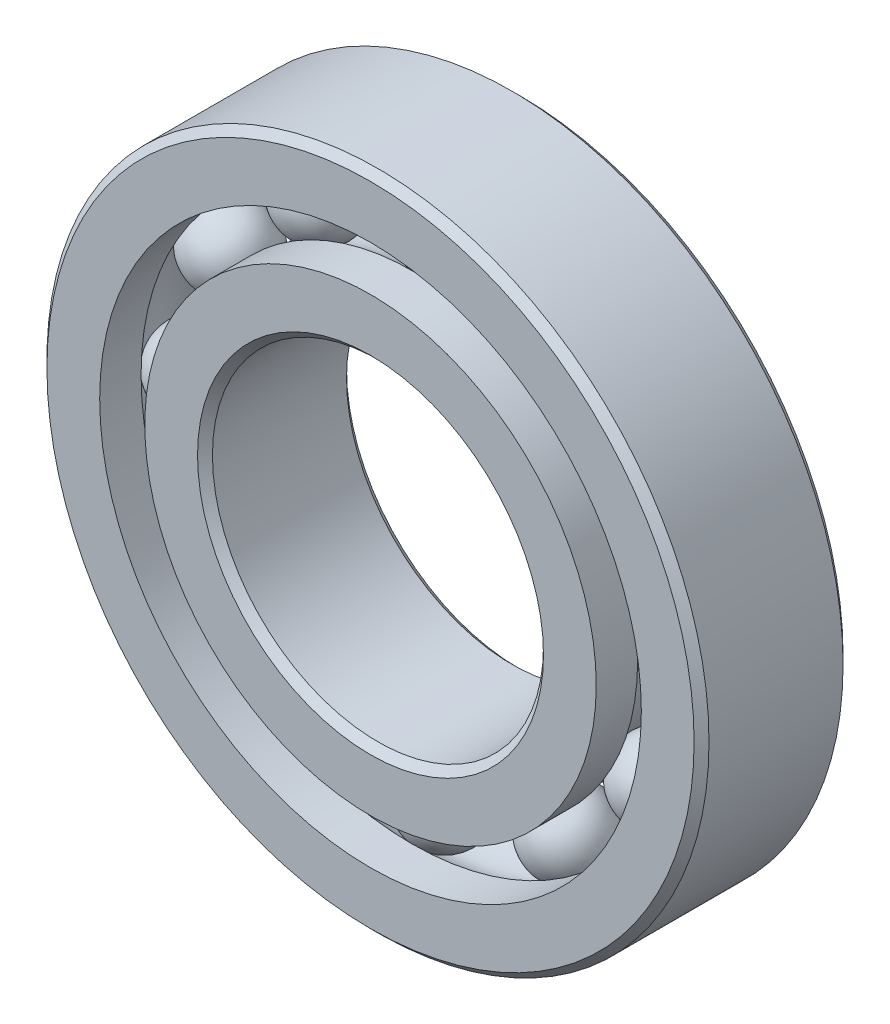
ISO-10303-21;
HEADER;
FILE_DESCRIPTION(('STEP AP214'),'2;1');
FILE_NAME('part.step','',(''),(''),'','','');
FILE_SCHEMA(('AUTOMOTIVE_DESIGN { 1 0 10303 214 1 1 1 1 }'));
ENDSEC;
DATA;
#1=APPLICATION_CONTEXT('core data for automotive mechanical design processes');
#2=APPLICATION_PROTOCOL_DEFINITION('international standard','automotive_design',2000,#1);
#3=PRODUCT_CONTEXT('',#1,'mechanical');
#4=PRODUCT('Part','Part','',(#3));
#5=PRODUCT_RELATED_PRODUCT_CATEGORY('part','',(#4));
#6=PRODUCT_DEFINITION_FORMATION('','',#4);
#7=PRODUCT_DEFINITION_CONTEXT('part definition',#1,'design');
#8=PRODUCT_DEFINITION('design','',#6,#7);
#9=PRODUCT_DEFINITION_SHAPE('','',#8);
#10=(LENGTH_UNIT() NAMED_UNIT(*) SI_UNIT(.MILLI.,.METRE.));
#11=(NAMED_UNIT(*) PLANE_ANGLE_UNIT() SI_UNIT($,.RADIAN.));
#12=(NAMED_UNIT(*) SI_UNIT($,.STERADIAN.) SOLID_ANGLE_UNIT());
#13=UNCERTAINTY_MEASURE_WITH_UNIT(LENGTH_MEASURE(1.E-05),#10,'distance_accuracy_value','');
#14=(GEOMETRIC_REPRESENTATION_CONTEXT(3) GLOBAL_UNCERTAINTY_ASSIGNED_CONTEXT((#13)) GLOBAL_UNIT_ASSIGNED_CONTEXT((#10,
#11,#12)) REPRESENTATION_CONTEXT('',''));
#15=CARTESIAN_POINT('',(0.,0.,0.));
#16=DIRECTION('',(0.,0.,1.));
#17=DIRECTION('',(1.,0.,0.));
#18=AXIS2_PLACEMENT_3D('',#15,#16,#17);
#19=CARTESIAN_POINT('',(-14.9999999999997,25.9807621135334,0.));
#20=DIRECTION('',(0.,0.,1.));
#21=DIRECTION('',(-0.499999999999989,0.866025403784445,0.));
#22=AXIS2_PLACEMENT_3D('',#19,#20,#21);
#23=SPHERICAL_SURFACE('',#22,4.84015726275719);
#24=CARTESIAN_POINT('',(-14.9999999999997,25.9807621135334,4.8401572627572));
#25=VERTEX_POINT('',#24);
#26=VERTEX_LOOP('',#25);
#27=FACE_BOUND('',#26,.T.);
#28=ADVANCED_FACE('F39',(#27),#23,.T.);
#29=CLOSED_SHELL('',(#28));
#30=MANIFOLD_SOLID_BREP('B2',#29);
#31=CARTESIAN_POINT('',(-25.980762113533,15.0000000000003,0.));
#32=DIRECTION('',(0.,0.,1.));
#33=DIRECTION('',(-0.866025403784433,0.50000000000001,0.));
#34=AXIS2_PLACEMENT_3D('',#31,#32,#33);
#35=SPHERICAL_SURFACE('',#34,4.84015726275719);
#36=CARTESIAN_POINT('',(-25.980762113533,15.0000000000003,4.8401572627572));
#37=VERTEX_POINT('',#36);
#38=VERTEX_LOOP('',#37);
#39=FACE_BOUND('',#38,.T.);
#40=ADVANCED_FACE('F59',(#39),#35,.T.);
#41=CLOSED_SHELL('',(#40));
#42=MANIFOLD_SOLID_BREP('B6',#41);
#43=CARTESIAN_POINT('',(-30.,3.14233320495882E-13,0.));
#44=DIRECTION('',(0.,0.,1.));
#45=DIRECTION('',(-1.,0.,0.));
#46=AXIS2_PLACEMENT_3D('',#43,#44,#45);
#47=SPHERICAL_SURFACE('',#46,4.84015726275719);
#48=CARTESIAN_POINT('',(-30.,3.14233320495882E-13,4.8401572627572));
#49=VERTEX_POINT('',#48);
#50=VERTEX_LOOP('',#49);
#51=FACE_BOUND('',#50,.T.);
#52=ADVANCED_FACE('F79',(#51),#47,.T.);
#53=CLOSED_SHELL('',(#52));
#54=MANIFOLD_SOLID_BREP('B35',#53);
#55=CARTESIAN_POINT('',(-25.9807621135333,-14.9999999999998,0.));
#56=DIRECTION('',(0.,0.,1.));
#57=DIRECTION('',(-0.866025403784443,-0.499999999999992,0.));
#58=AXIS2_PLACEMENT_3D('',#55,#56,#57);
#59=SPHERICAL_SURFACE('',#58,4.84015726275719);
#60=CARTESIAN_POINT('',(-25.9807621135333,-14.9999999999998,4.8401572627572));
#61=VERTEX_POINT('',#60);
#62=VERTEX_LOOP('',#61);
#63=FACE_BOUND('',#62,.T.);
#64=ADVANCED_FACE('F99',(#63),#59,.T.);
#65=CLOSED_SHELL('',(#64));
#66=MANIFOLD_SOLID_BREP('B55',#65);
#67=CARTESIAN_POINT('',(-15.0000000000002,-25.980762113533,0.));
#68=DIRECTION('',(0.,0.,1.));
#69=DIRECTION('',(-0.500000000000007,-0.866025403784435,0.));
#70=AXIS2_PLACEMENT_3D('',#67,#68,#69);
#71=SPHERICAL_SURFACE('',#70,4.84015726275719);
#72=CARTESIAN_POINT('',(-15.0000000000002,-25.980762113533,4.8401572627572));
#73=VERTEX_POINT('',#72);
#74=VERTEX_LOOP('',#73);
#75=FACE_BOUND('',#74,.T.);
#76=ADVANCED_FACE('F119',(#75),#71,.T.);
#77=CLOSED_SHELL('',(#76));
#78=MANIFOLD_SOLID_BREP('B75',#77);
#79=CARTESIAN_POINT('',(-2.09488880330588E-13,-30.,0.));
#80=DIRECTION('',(0.,0.,1.));
#81=DIRECTION('',(0.,-1.,0.));
#82=AXIS2_PLACEMENT_3D('',#79,#80,#81);
#83=SPHERICAL_SURFACE('',#82,4.84015726275719);
#84=CARTESIAN_POINT('',(-2.09488880330588E-13,-30.,4.8401572627572));
#85=VERTEX_POINT('',#84);
#86=VERTEX_LOOP('',#85);
#87=FACE_BOUND('',#86,.T.);
#88=ADVANCED_FACE('F139',(#87),#83,.T.);
#89=CLOSED_SHELL('',(#88));
#90=MANIFOLD_SOLID_BREP('B95',#89);
#91=CARTESIAN_POINT('',(14.9999999999998,-25.9807621135332,0.));
#92=DIRECTION('',(0.,0.,1.));
#93=DIRECTION('',(0.499999999999995,-0.866025403784442,0.));
#94=AXIS2_PLACEMENT_3D('',#91,#92,#93);
#95=SPHERICAL_SURFACE('',#94,4.84015726275719);
#96=CARTESIAN_POINT('',(14.9999999999998,-25.9807621135332,4.8401572627572));
#97=VERTEX_POINT('',#96);
#98=VERTEX_LOOP('',#97);
#99=FACE_BOUND('',#98,.T.);
#100=ADVANCED_FACE('F159',(#99),#95,.T.);
#101=CLOSED_SHELL('',(#100));
#102=MANIFOLD_SOLID_BREP('B115',#101);
#103=CARTESIAN_POINT('',(25.9807621135331,-15.0000000000001,0.));
#104=DIRECTION('',(0.,0.,1.));
#105=DIRECTION('',(0.866025403784436,-0.500000000000004,0.));
#106=AXIS2_PLACEMENT_3D('',#103,#104,#105);
#107=SPHERICAL_SURFACE('',#106,4.84015726275719);
#108=CARTESIAN_POINT('',(25.9807621135331,-15.0000000000001,4.8401572627572));
#109=VERTEX_POINT('',#108);
#110=VERTEX_LOOP('',#109);
#111=FACE_BOUND('',#110,.T.);
#112=ADVANCED_FACE('F179',(#111),#107,.T.);
#113=CLOSED_SHELL('',(#112));
#114=MANIFOLD_SOLID_BREP('B135',#113);
#115=CARTESIAN_POINT('',(30.,-1.04744440165294E-13,0.));
#116=DIRECTION('',(0.,0.,1.));
#117=DIRECTION('',(1.,0.,0.));
#118=AXIS2_PLACEMENT_3D('',#115,#116,#117);
#119=SPHERICAL_SURFACE('',#118,4.84015726275719);
#120=CARTESIAN_POINT('',(30.,-1.04744440165294E-13,4.8401572627572));
#121=VERTEX_POINT('',#120);
#122=VERTEX_LOOP('',#121);
#123=FACE_BOUND('',#122,.T.);
#124=ADVANCED_FACE('F199',(#123),#119,.T.);
#125=CLOSED_SHELL('',(#124));
#126=MANIFOLD_SOLID_BREP('B155',#125);
#127=CARTESIAN_POINT('',(25.9807621135332,14.9999999999999,0.));
#128=DIRECTION('',(0.,0.,1.));
#129=DIRECTION('',(0.86602540378444,0.499999999999998,0.));
#130=AXIS2_PLACEMENT_3D('',#127,#128,#129);
#131=SPHERICAL_SURFACE('',#130,4.84015726275719);
#132=CARTESIAN_POINT('',(25.9807621135332,14.9999999999999,4.8401572627572));
#133=VERTEX_POINT('',#132);
#134=VERTEX_LOOP('',#133);
#135=FACE_BOUND('',#134,.T.);
#136=ADVANCED_FACE('F219',(#135),#131,.T.);
#137=CLOSED_SHELL('',(#136));
#138=MANIFOLD_SOLID_BREP('B175',#137);
#139=CARTESIAN_POINT('',(15.,25.9807621135331,0.));
#140=DIRECTION('',(0.,0.,1.));
#141=DIRECTION('',(0.500000000000001,0.866025403784438,0.));
#142=AXIS2_PLACEMENT_3D('',#139,#140,#141);
#143=SPHERICAL_SURFACE('',#142,4.84015726275719);
#144=CARTESIAN_POINT('',(15.,25.9807621135331,4.8401572627572));
#145=VERTEX_POINT('',#144);
#146=VERTEX_LOOP('',#145);
#147=FACE_BOUND('',#146,.T.);
#148=ADVANCED_FACE('F239',(#147),#143,.T.);
#149=CLOSED_SHELL('',(#148));
#150=MANIFOLD_SOLID_BREP('B195',#149);
#151=CARTESIAN_POINT('',(0.,30.,0.));
#152=DIRECTION('',(0.,0.,1.));
#153=DIRECTION('',(0.,1.,0.));
#154=AXIS2_PLACEMENT_3D('',#151,#152,#153);
#155=SPHERICAL_SURFACE('',#154,4.84015726275719);
#156=CARTESIAN_POINT('',(0.,30.,4.8401572627572));
#157=VERTEX_POINT('',#156);
#158=VERTEX_LOOP('',#157);
#159=FACE_BOUND('',#158,.T.);
#160=ADVANCED_FACE('F261',(#159),#155,.T.);
#161=CLOSED_SHELL('',(#160));
#162=MANIFOLD_SOLID_BREP('B215',#161);
#163=CARTESIAN_POINT('',(0.,27.2747252747253,9.00000000000001));
#164=DIRECTION('',(0.,0.,-1.));
#165=DIRECTION('',(-1.,0.,0.));
#166=AXIS2_PLACEMENT_3D('',#163,#164,#165);
#167=PLANE('',#166);
#168=CARTESIAN_POINT('',(0.,0.,9.00000000000001));
#169=DIRECTION('',(0.,0.,1.));
#170=DIRECTION('',(1.,0.,0.));
#171=AXIS2_PLACEMENT_3D('',#168,#169,#170);
#172=CIRCLE('',#171,20.9);
#173=CARTESIAN_POINT('',(20.9,0.,9.00000000000001));
#174=VERTEX_POINT('',#173);
#175=EDGE_CURVE('E308',#174,#174,#172,.T.);
#176=ORIENTED_EDGE('',*,*,#175,.F.);
#177=EDGE_LOOP('',(#176));
#178=FACE_BOUND('',#177,.T.);
#179=CARTESIAN_POINT('',(0.,0.,9.00000000000001));
#180=DIRECTION('',(0.,0.,1.));
#181=DIRECTION('',(1.,0.,0.));
#182=AXIS2_PLACEMENT_3D('',#179,#180,#181);
#183=CIRCLE('',#182,27.2747252747253);
#184=CARTESIAN_POINT('',(27.2747252747253,0.,9.00000000000001));
#185=VERTEX_POINT('',#184);
#186=EDGE_CURVE('E260',#185,#185,#183,.T.);
#187=ORIENTED_EDGE('',*,*,#186,.T.);
#188=EDGE_LOOP('',(#187));
#189=FACE_BOUND('',#188,.T.);
#190=ADVANCED_FACE('F280',(#178,#189),#167,.F.);
#191=CARTESIAN_POINT('',(0.,0.,9.));
#192=DIRECTION('',(0.,0.,1.));
#193=DIRECTION('',(1.,0.,0.));
#194=AXIS2_PLACEMENT_3D('',#191,#192,#193);
#195=CYLINDRICAL_SURFACE('',#194,27.2747252747253);
#196=ORIENTED_EDGE('',*,*,#186,.F.);
#197=EDGE_LOOP('',(#196));
#198=FACE_BOUND('',#197,.T.);
#199=CARTESIAN_POINT('',(0.,0.,4.));
#200=DIRECTION('',(0.,0.,1.));
#201=DIRECTION('',(1.,0.,0.));
#202=AXIS2_PLACEMENT_3D('',#199,#200,#201);
#203=CIRCLE('',#202,27.2747252747253);
#204=CARTESIAN_POINT('',(27.2747252747253,0.,4.));
#205=VERTEX_POINT('',#204);
#206=EDGE_CURVE('E286',#205,#205,#203,.T.);
#207=ORIENTED_EDGE('',*,*,#206,.T.);
#208=EDGE_LOOP('',(#207));
#209=FACE_BOUND('',#208,.T.);
#210=ADVANCED_FACE('F315',(#198,#209),#195,.T.);
#211=CARTESIAN_POINT('',(0.,0.,0.));
#212=DIRECTION('',(0.,0.,1.));
#213=DIRECTION('',(1.,0.,0.));
#214=AXIS2_PLACEMENT_3D('',#211,#212,#213);
#215=TOROIDAL_SURFACE('',#214,30.,4.84015726275719);
#216=ORIENTED_EDGE('',*,*,#206,.F.);
#217=EDGE_LOOP('',(#216));
#218=FACE_BOUND('',#217,.T.);
#219=CARTESIAN_POINT('',(0.,0.,-4.00000000000001));
#220=DIRECTION('',(0.,0.,1.));
#221=DIRECTION('',(1.,0.,0.));
#222=AXIS2_PLACEMENT_3D('',#219,#220,#221);
#223=CIRCLE('',#222,27.2747252747253);
#224=CARTESIAN_POINT('',(27.2747252747253,0.,-4.00000000000001));
#225=VERTEX_POINT('',#224);
#226=EDGE_CURVE('E290',#225,#225,#223,.T.);
#227=ORIENTED_EDGE('',*,*,#226,.T.);
#228=EDGE_LOOP('',(#227));
#229=FACE_BOUND('',#228,.T.);
#230=ADVANCED_FACE('F319',(#218,#229),#215,.F.);
#231=CARTESIAN_POINT('',(0.,0.,9.));
#232=DIRECTION('',(0.,0.,1.));
#233=DIRECTION('',(1.,0.,0.));
#234=AXIS2_PLACEMENT_3D('',#231,#232,#233);
#235=CYLINDRICAL_SURFACE('',#234,27.2747252747253);
#236=ORIENTED_EDGE('',*,*,#226,.F.);
#237=EDGE_LOOP('',(#236));
#238=FACE_BOUND('',#237,.T.);
#239=CARTESIAN_POINT('',(0.,0.,-9.));
#240=DIRECTION('',(0.,0.,1.));
#241=DIRECTION('',(1.,0.,0.));
#242=AXIS2_PLACEMENT_3D('',#239,#240,#241);
#243=CIRCLE('',#242,27.2747252747253);
#244=CARTESIAN_POINT('',(27.2747252747253,0.,-9.));
#245=VERTEX_POINT('',#244);
#246=EDGE_CURVE('E294',#245,#245,#243,.T.);
#247=ORIENTED_EDGE('',*,*,#246,.T.);
#248=EDGE_LOOP('',(#247));
#249=FACE_BOUND('',#248,.T.);
#250=ADVANCED_FACE('F324',(#238,#249),#235,.T.);
#251=CARTESIAN_POINT('',(0.,20.9,-9.00000000000001));
#252=DIRECTION('',(0.,0.,1.));
#253=DIRECTION('',(1.,0.,0.));
#254=AXIS2_PLACEMENT_3D('',#251,#252,#253);
#255=PLANE('',#254);
#256=ORIENTED_EDGE('',*,*,#246,.F.);
#257=EDGE_LOOP('',(#256));
#258=FACE_BOUND('',#257,.T.);
#259=CARTESIAN_POINT('',(0.,0.,-9.));
#260=DIRECTION('',(0.,0.,1.));
#261=DIRECTION('',(1.,0.,0.));
#262=AXIS2_PLACEMENT_3D('',#259,#260,#261);
#263=CIRCLE('',#262,20.9);
#264=CARTESIAN_POINT('',(20.9,0.,-9.));
#265=VERTEX_POINT('',#264);
#266=EDGE_CURVE('E299',#265,#265,#263,.T.);
#267=ORIENTED_EDGE('',*,*,#266,.T.);
#268=EDGE_LOOP('',(#267));
#269=FACE_BOUND('',#268,.T.);
#270=ADVANCED_FACE('F330',(#258,#269),#255,.F.);
#271=CARTESIAN_POINT('',(0.,0.,-8.1));
#272=DIRECTION('',(0.,0.,-1.));
#273=DIRECTION('',(-1.,0.,0.));
#274=AXIS2_PLACEMENT_3D('',#271,#272,#273);
#275=CONICAL_SURFACE('',#274,20.,0.785398163397441);
#276=ORIENTED_EDGE('',*,*,#266,.F.);
#277=EDGE_LOOP('',(#276));
#278=FACE_BOUND('',#277,.T.);
#279=CARTESIAN_POINT('',(0.,0.,-8.1));
#280=DIRECTION('',(0.,0.,1.));
#281=DIRECTION('',(1.,0.,0.));
#282=AXIS2_PLACEMENT_3D('',#279,#280,#281);
#283=CIRCLE('',#282,20.);
#284=CARTESIAN_POINT('',(20.,0.,-8.1));
#285=VERTEX_POINT('',#284);
#286=EDGE_CURVE('E302',#285,#285,#283,.T.);
#287=ORIENTED_EDGE('',*,*,#286,.T.);
#288=EDGE_LOOP('',(#287));
#289=FACE_BOUND('',#288,.T.);
#290=ADVANCED_FACE('F334',(#278,#289),#275,.F.);
#291=CARTESIAN_POINT('',(0.,0.,9.));
#292=DIRECTION('',(0.,0.,1.));
#293=DIRECTION('',(1.,0.,0.));
#294=AXIS2_PLACEMENT_3D('',#291,#292,#293);
#295=CYLINDRICAL_SURFACE('',#294,20.);
#296=ORIENTED_EDGE('',*,*,#286,.F.);
#297=EDGE_LOOP('',(#296));
#298=FACE_BOUND('',#297,.T.);
#299=CARTESIAN_POINT('',(0.,0.,8.10000000000001));
#300=DIRECTION('',(0.,0.,1.));
#301=DIRECTION('',(1.,0.,0.));
#302=AXIS2_PLACEMENT_3D('',#299,#300,#301);
#303=CIRCLE('',#302,20.);
#304=CARTESIAN_POINT('',(20.,0.,8.10000000000001));
#305=VERTEX_POINT('',#304);
#306=EDGE_CURVE('E305',#305,#305,#303,.T.);
#307=ORIENTED_EDGE('',*,*,#306,.T.);
#308=EDGE_LOOP('',(#307));
#309=FACE_BOUND('',#308,.T.);
#310=ADVANCED_FACE('F338',(#298,#309),#295,.F.);
#311=CARTESIAN_POINT('',(0.,0.,9.00000000000001));
#312=DIRECTION('',(0.,0.,1.));
#313=DIRECTION('',(1.,0.,0.));
#314=AXIS2_PLACEMENT_3D('',#311,#312,#313);
#315=CONICAL_SURFACE('',#314,20.9,0.785398163397456);
#316=ORIENTED_EDGE('',*,*,#306,.F.);
#317=EDGE_LOOP('',(#316));
#318=FACE_BOUND('',#317,.T.);
#319=ORIENTED_EDGE('',*,*,#175,.T.);
#320=EDGE_LOOP('',(#319));
#321=FACE_BOUND('',#320,.T.);
#322=ADVANCED_FACE('F312',(#318,#321),#315,.F.);
#323=CLOSED_SHELL('',(#190,#210,#230,#250,#270,#290,#310,#322));
#324=MANIFOLD_SOLID_BREP('B235',#323);
#325=CARTESIAN_POINT('',(0.,0.,8.10000000000001));
#326=DIRECTION('',(0.,0.,-1.));
#327=DIRECTION('',(-1.,0.,0.));
#328=AXIS2_PLACEMENT_3D('',#325,#326,#327);
#329=CONICAL_SURFACE('',#328,40.,0.785398163397448);
#330=CARTESIAN_POINT('',(0.,0.,9.00000000000001));
#331=DIRECTION('',(0.,0.,1.));
#332=DIRECTION('',(1.,0.,0.));
#333=AXIS2_PLACEMENT_3D('',#330,#331,#332);
#334=CIRCLE('',#333,39.1);
#335=CARTESIAN_POINT('',(39.1,0.,9.00000000000001));
#336=VERTEX_POINT('',#335);
#337=EDGE_CURVE('E429',#336,#336,#334,.T.);
#338=ORIENTED_EDGE('',*,*,#337,.F.);
#339=EDGE_LOOP('',(#338));
#340=FACE_BOUND('',#339,.T.);
#341=CARTESIAN_POINT('',(0.,0.,8.10000000000001));
#342=DIRECTION('',(0.,0.,1.));
#343=DIRECTION('',(1.,0.,0.));
#344=AXIS2_PLACEMENT_3D('',#341,#342,#343);
#345=CIRCLE('',#344,40.);
#346=CARTESIAN_POINT('',(40.,0.,8.10000000000001));
#347=VERTEX_POINT('',#346);
#348=EDGE_CURVE('E279',#347,#347,#345,.T.);
#349=ORIENTED_EDGE('',*,*,#348,.T.);
#350=EDGE_LOOP('',(#349));
#351=FACE_BOUND('',#350,.T.);
#352=ADVANCED_FACE('F401',(#340,#351),#329,.T.);
#353=CARTESIAN_POINT('',(0.,0.,9.));
#354=DIRECTION('',(0.,0.,1.));
#355=DIRECTION('',(1.,0.,0.));
#356=AXIS2_PLACEMENT_3D('',#353,#354,#355);
#357=CYLINDRICAL_SURFACE('',#356,40.);
#358=ORIENTED_EDGE('',*,*,#348,.F.);
#359=EDGE_LOOP('',(#358));
#360=FACE_BOUND('',#359,.T.);
#361=CARTESIAN_POINT('',(0.,0.,-8.1));
#362=DIRECTION('',(0.,0.,1.));
#363=DIRECTION('',(1.,0.,0.));
#364=AXIS2_PLACEMENT_3D('',#361,#362,#363);
#365=CIRCLE('',#364,40.);
#366=CARTESIAN_POINT('',(40.,0.,-8.1));
#367=VERTEX_POINT('',#366);
#368=EDGE_CURVE('E407',#367,#367,#365,.T.);
#369=ORIENTED_EDGE('',*,*,#368,.T.);
#370=EDGE_LOOP('',(#369));
#371=FACE_BOUND('',#370,.T.);
#372=ADVANCED_FACE('F436',(#360,#371),#357,.T.);
#373=CARTESIAN_POINT('',(0.,0.,-9.));
#374=DIRECTION('',(0.,0.,1.));
#375=DIRECTION('',(1.,0.,0.));
#376=AXIS2_PLACEMENT_3D('',#373,#374,#375);
#377=CONICAL_SURFACE('',#376,39.1,0.785398163397445);
#378=ORIENTED_EDGE('',*,*,#368,.F.);
#379=EDGE_LOOP('',(#378));
#380=FACE_BOUND('',#379,.T.);
#381=CARTESIAN_POINT('',(0.,0.,-9.));
#382=DIRECTION('',(0.,0.,1.));
#383=DIRECTION('',(1.,0.,0.));
#384=AXIS2_PLACEMENT_3D('',#381,#382,#383);
#385=CIRCLE('',#384,39.1);
#386=CARTESIAN_POINT('',(39.1,0.,-9.));
#387=VERTEX_POINT('',#386);
#388=EDGE_CURVE('E411',#387,#387,#385,.T.);
#389=ORIENTED_EDGE('',*,*,#388,.T.);
#390=EDGE_LOOP('',(#389));
#391=FACE_BOUND('',#390,.T.);
#392=ADVANCED_FACE('F440',(#380,#391),#377,.T.);
#393=CARTESIAN_POINT('',(0.,39.1,-9.));
#394=DIRECTION('',(0.,0.,1.));
#395=DIRECTION('',(1.,0.,0.));
#396=AXIS2_PLACEMENT_3D('',#393,#394,#395);
#397=PLANE('',#396);
#398=ORIENTED_EDGE('',*,*,#388,.F.);
#399=EDGE_LOOP('',(#398));
#400=FACE_BOUND('',#399,.T.);
#401=CARTESIAN_POINT('',(0.,0.,-9.));
#402=DIRECTION('',(0.,0.,1.));
#403=DIRECTION('',(1.,0.,0.));
#404=AXIS2_PLACEMENT_3D('',#401,#402,#403);
#405=CIRCLE('',#404,32.7252747252747);
#406=CARTESIAN_POINT('',(32.7252747252747,0.,-9.));
#407=VERTEX_POINT('',#406);
#408=EDGE_CURVE('E415',#407,#407,#405,.T.);
#409=ORIENTED_EDGE('',*,*,#408,.T.);
#410=EDGE_LOOP('',(#409));
#411=FACE_BOUND('',#410,.T.);
#412=ADVANCED_FACE('F445',(#400,#411),#397,.F.);
#413=CARTESIAN_POINT('',(0.,0.,9.));
#414=DIRECTION('',(0.,0.,1.));
#415=DIRECTION('',(1.,0.,0.));
#416=AXIS2_PLACEMENT_3D('',#413,#414,#415);
#417=CYLINDRICAL_SURFACE('',#416,32.7252747252747);
#418=ORIENTED_EDGE('',*,*,#408,.F.);
#419=EDGE_LOOP('',(#418));
#420=FACE_BOUND('',#419,.T.);
#421=CARTESIAN_POINT('',(0.,0.,-4.));
#422=DIRECTION('',(0.,0.,1.));
#423=DIRECTION('',(1.,0.,0.));
#424=AXIS2_PLACEMENT_3D('',#421,#422,#423);
#425=CIRCLE('',#424,32.7252747252747);
#426=CARTESIAN_POINT('',(32.7252747252747,0.,-4.));
#427=VERTEX_POINT('',#426);
#428=EDGE_CURVE('E420',#427,#427,#425,.T.);
#429=ORIENTED_EDGE('',*,*,#428,.T.);
#430=EDGE_LOOP('',(#429));
#431=FACE_BOUND('',#430,.T.);
#432=ADVANCED_FACE('F451',(#420,#431),#417,.F.);
#433=CARTESIAN_POINT('',(0.,0.,0.));
#434=DIRECTION('',(0.,0.,1.));
#435=DIRECTION('',(1.,0.,0.));
#436=AXIS2_PLACEMENT_3D('',#433,#434,#435);
#437=TOROIDAL_SURFACE('',#436,30.,4.84015726275719);
#438=ORIENTED_EDGE('',*,*,#428,.F.);
#439=EDGE_LOOP('',(#438));
#440=FACE_BOUND('',#439,.T.);
#441=CARTESIAN_POINT('',(0.,0.,4.));
#442=DIRECTION('',(0.,0.,1.));
#443=DIRECTION('',(1.,0.,0.));
#444=AXIS2_PLACEMENT_3D('',#441,#442,#443);
#445=CIRCLE('',#444,32.7252747252747);
#446=CARTESIAN_POINT('',(32.7252747252747,0.,4.));
#447=VERTEX_POINT('',#446);
#448=EDGE_CURVE('E423',#447,#447,#445,.T.);
#449=ORIENTED_EDGE('',*,*,#448,.T.);
#450=EDGE_LOOP('',(#449));
#451=FACE_BOUND('',#450,.T.);
#452=ADVANCED_FACE('F455',(#440,#451),#437,.F.);
#453=CARTESIAN_POINT('',(0.,0.,9.));
#454=DIRECTION('',(0.,0.,1.));
#455=DIRECTION('',(1.,0.,0.));
#456=AXIS2_PLACEMENT_3D('',#453,#454,#455);
#457=CYLINDRICAL_SURFACE('',#456,32.7252747252747);
#458=ORIENTED_EDGE('',*,*,#448,.F.);
#459=EDGE_LOOP('',(#458));
#460=FACE_BOUND('',#459,.T.);
#461=CARTESIAN_POINT('',(0.,0.,9.00000000000001));
#462=DIRECTION('',(0.,0.,1.));
#463=DIRECTION('',(1.,0.,0.));
#464=AXIS2_PLACEMENT_3D('',#461,#462,#463);
#465=CIRCLE('',#464,32.7252747252747);
#466=CARTESIAN_POINT('',(32.7252747252747,0.,9.00000000000001));
#467=VERTEX_POINT('',#466);
#468=EDGE_CURVE('E426',#467,#467,#465,.T.);
#469=ORIENTED_EDGE('',*,*,#468,.T.);
#470=EDGE_LOOP('',(#469));
#471=FACE_BOUND('',#470,.T.);
#472=ADVANCED_FACE('F459',(#460,#471),#457,.F.);
#473=CARTESIAN_POINT('',(0.,39.1,9.00000000000001));
#474=DIRECTION('',(0.,0.,-1.));
#475=DIRECTION('',(-1.,0.,0.));
#476=AXIS2_PLACEMENT_3D('',#473,#474,#475);
#477=PLANE('',#476);
#478=ORIENTED_EDGE('',*,*,#468,.F.);
#479=EDGE_LOOP('',(#478));
#480=FACE_BOUND('',#479,.T.);
#481=ORIENTED_EDGE('',*,*,#337,.T.);
#482=EDGE_LOOP('',(#481));
#483=FACE_BOUND('',#482,.T.);
#484=ADVANCED_FACE('F433',(#480,#483),#477,.F.);
#485=CLOSED_SHELL('',(#352,#372,#392,#412,#432,#452,#472,#484));
#486=MANIFOLD_SOLID_BREP('B255',#485);
#487=ADVANCED_BREP_SHAPE_REPRESENTATION('',(#18,#30,#42,#54,#66,#78,#90,#102,#114,#126,#138,
#150,#162,#324,#486),#14);
#488=SHAPE_DEFINITION_REPRESENTATION(#9,#487);
ENDSEC;
END-ISO-10303-21;
